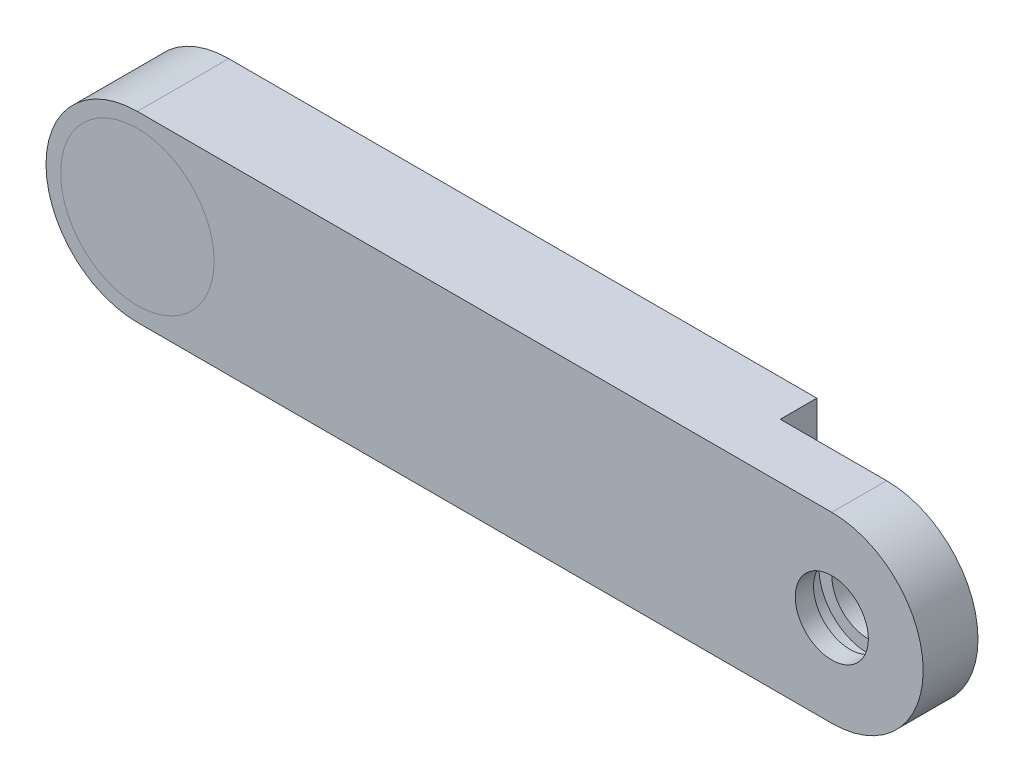
ISO-10303-21;
HEADER;
FILE_DESCRIPTION(('STEP AP214'),'2;1');
FILE_NAME('part.step','',(''),(''),'','','');
FILE_SCHEMA(('AUTOMOTIVE_DESIGN { 1 0 10303 214 1 1 1 1 }'));
ENDSEC;
DATA;
#1=APPLICATION_CONTEXT('core data for automotive mechanical design processes');
#2=APPLICATION_PROTOCOL_DEFINITION('international standard','automotive_design',2000,#1);
#3=PRODUCT_CONTEXT('',#1,'mechanical');
#4=PRODUCT('Part','Part','',(#3));
#5=PRODUCT_RELATED_PRODUCT_CATEGORY('part','',(#4));
#6=PRODUCT_DEFINITION_FORMATION('','',#4);
#7=PRODUCT_DEFINITION_CONTEXT('part definition',#1,'design');
#8=PRODUCT_DEFINITION('design','',#6,#7);
#9=PRODUCT_DEFINITION_SHAPE('','',#8);
#10=(LENGTH_UNIT() NAMED_UNIT(*) SI_UNIT(.MILLI.,.METRE.));
#11=(NAMED_UNIT(*) PLANE_ANGLE_UNIT() SI_UNIT($,.RADIAN.));
#12=(NAMED_UNIT(*) SI_UNIT($,.STERADIAN.) SOLID_ANGLE_UNIT());
#13=UNCERTAINTY_MEASURE_WITH_UNIT(LENGTH_MEASURE(1.E-05),#10,'distance_accuracy_value','');
#14=(GEOMETRIC_REPRESENTATION_CONTEXT(3) GLOBAL_UNCERTAINTY_ASSIGNED_CONTEXT((#13)) GLOBAL_UNIT_ASSIGNED_CONTEXT((#10,
#11,#12)) REPRESENTATION_CONTEXT('',''));
#15=CARTESIAN_POINT('',(0.,0.,0.));
#16=DIRECTION('',(0.,0.,1.));
#17=DIRECTION('',(1.,0.,0.));
#18=AXIS2_PLACEMENT_3D('',#15,#16,#17);
#19=CARTESIAN_POINT('',(-154.944852941176,0.,22.));
#20=DIRECTION('',(0.,0.,1.));
#21=DIRECTION('',(1.,0.,0.));
#22=AXIS2_PLACEMENT_3D('',#19,#20,#21);
#23=CYLINDRICAL_SURFACE('',#22,21.);
#24=CARTESIAN_POINT('',(-154.944852941176,0.,22.));
#25=DIRECTION('',(0.,0.,1.));
#26=DIRECTION('',(1.,0.,0.));
#27=AXIS2_PLACEMENT_3D('',#24,#25,#26);
#28=CIRCLE('',#27,21.);
#29=CARTESIAN_POINT('',(-133.944852941176,0.,22.));
#30=VERTEX_POINT('',#29);
#31=EDGE_CURVE('E11',#30,#30,#28,.T.);
#32=ORIENTED_EDGE('',*,*,#31,.T.);
#33=EDGE_LOOP('',(#32));
#34=FACE_BOUND('',#33,.T.);
#35=CARTESIAN_POINT('',(-154.944852941176,0.,25.));
#36=DIRECTION('',(0.,0.,1.));
#37=DIRECTION('',(1.,0.,0.));
#38=AXIS2_PLACEMENT_3D('',#35,#36,#37);
#39=CIRCLE('',#38,21.);
#40=CARTESIAN_POINT('',(-133.944852941176,0.,25.));
#41=VERTEX_POINT('',#40);
#42=EDGE_CURVE('E52',#41,#41,#39,.T.);
#43=ORIENTED_EDGE('',*,*,#42,.F.);
#44=EDGE_LOOP('',(#43));
#45=FACE_BOUND('',#44,.T.);
#46=ADVANCED_FACE('F49',(#34,#45),#23,.T.);
#47=CARTESIAN_POINT('',(-154.944852941176,0.,22.));
#48=DIRECTION('',(0.,0.,1.));
#49=DIRECTION('',(1.,0.,0.));
#50=AXIS2_PLACEMENT_3D('',#47,#48,#49);
#51=PLANE('',#50);
#52=ORIENTED_EDGE('',*,*,#31,.F.);
#53=EDGE_LOOP('',(#52));
#54=FACE_BOUND('',#53,.T.);
#55=ADVANCED_FACE('F64',(#54),#51,.F.);
#56=CARTESIAN_POINT('',(-154.944852941176,0.,25.));
#57=DIRECTION('',(0.,0.,1.));
#58=DIRECTION('',(1.,0.,0.));
#59=AXIS2_PLACEMENT_3D('',#56,#57,#58);
#60=PLANE('',#59);
#61=ORIENTED_EDGE('',*,*,#42,.T.);
#62=EDGE_LOOP('',(#61));
#63=FACE_BOUND('',#62,.T.);
#64=ADVANCED_FACE('F61',(#63),#60,.T.);
#65=CLOSED_SHELL('',(#46,#55,#64));
#66=MANIFOLD_SOLID_BREP('B2',#65);
#67=CARTESIAN_POINT('',(35.0551470588235,0.,25.));
#68=DIRECTION('',(0.,0.,-1.));
#69=DIRECTION('',(-1.,0.,0.));
#70=AXIS2_PLACEMENT_3D('',#67,#68,#69);
#71=CYLINDRICAL_SURFACE('',#70,25.);
#72=CARTESIAN_POINT('',(35.0551470588235,0.,10.));
#73=DIRECTION('',(0.,0.,-1.));
#74=DIRECTION('',(-1.,0.,0.));
#75=AXIS2_PLACEMENT_3D('',#72,#73,#74);
#76=CIRCLE('',#75,25.);
#77=CARTESIAN_POINT('',(35.0551470588235,25.,10.));
#78=VERTEX_POINT('',#77);
#79=CARTESIAN_POINT('',(35.0551470588235,-25.,10.));
#80=VERTEX_POINT('',#79);
#81=EDGE_CURVE('E155',#78,#80,#76,.T.);
#82=ORIENTED_EDGE('',*,*,#81,.F.);
#83=DIRECTION('',(0.,0.,-1.));
#84=VECTOR('',#83,1.);
#85=CARTESIAN_POINT('',(35.0551470588235,25.,25.));
#86=LINE('',#85,#84);
#87=CARTESIAN_POINT('',(35.0551470588235,25.,25.));
#88=VERTEX_POINT('',#87);
#89=EDGE_CURVE('E180',#88,#78,#86,.T.);
#90=ORIENTED_EDGE('',*,*,#89,.F.);
#91=CARTESIAN_POINT('',(35.0551470588235,0.,25.));
#92=DIRECTION('',(0.,0.,1.));
#93=DIRECTION('',(1.,0.,0.));
#94=AXIS2_PLACEMENT_3D('',#91,#92,#93);
#95=CIRCLE('',#94,25.);
#96=CARTESIAN_POINT('',(35.0551470588235,-25.,25.));
#97=VERTEX_POINT('',#96);
#98=EDGE_CURVE('E177',#97,#88,#95,.T.);
#99=ORIENTED_EDGE('',*,*,#98,.F.);
#100=DIRECTION('',(0.,0.,-1.));
#101=VECTOR('',#100,1.);
#102=CARTESIAN_POINT('',(35.0551470588235,-25.,25.));
#103=LINE('',#102,#101);
#104=EDGE_CURVE('E172',#97,#80,#103,.T.);
#105=ORIENTED_EDGE('',*,*,#104,.T.);
#106=EDGE_LOOP('',(#82,#90,#99,#105));
#107=FACE_BOUND('',#106,.T.);
#108=ADVANCED_FACE('F90',(#107),#71,.T.);
#109=CARTESIAN_POINT('',(35.0551470588235,0.,15.));
#110=DIRECTION('',(0.,0.,-1.));
#111=DIRECTION('',(-1.,0.,0.));
#112=AXIS2_PLACEMENT_3D('',#109,#110,#111);
#113=CYLINDRICAL_SURFACE('',#112,9.99999999999997);
#114=CARTESIAN_POINT('',(35.0551470588235,0.,15.));
#115=DIRECTION('',(0.,0.,-1.));
#116=DIRECTION('',(-1.,0.,0.));
#117=AXIS2_PLACEMENT_3D('',#114,#115,#116);
#118=CIRCLE('',#117,9.99999999999997);
#119=CARTESIAN_POINT('',(25.0551470588236,0.,15.));
#120=VERTEX_POINT('',#119);
#121=EDGE_CURVE('E272',#120,#120,#118,.T.);
#122=ORIENTED_EDGE('',*,*,#121,.F.);
#123=EDGE_LOOP('',(#122));
#124=FACE_BOUND('',#123,.T.);
#125=CARTESIAN_POINT('',(35.0551470588235,0.,10.));
#126=DIRECTION('',(0.,0.,-1.));
#127=DIRECTION('',(-1.,0.,0.));
#128=AXIS2_PLACEMENT_3D('',#125,#126,#127);
#129=CIRCLE('',#128,9.99999999999997);
#130=CARTESIAN_POINT('',(25.0551470588236,0.,10.));
#131=VERTEX_POINT('',#130);
#132=EDGE_CURVE('E94',#131,#131,#129,.F.);
#133=ORIENTED_EDGE('',*,*,#132,.F.);
#134=EDGE_LOOP('',(#133));
#135=FACE_BOUND('',#134,.T.);
#136=ADVANCED_FACE('F198',(#124,#135),#113,.F.);
#137=CARTESIAN_POINT('',(35.0551470588235,0.,0.));
#138=DIRECTION('',(0.,0.,1.));
#139=DIRECTION('',(1.,0.,0.));
#140=AXIS2_PLACEMENT_3D('',#137,#138,#139);
#141=CYLINDRICAL_SURFACE('',#140,13.4999999999999);
#142=CARTESIAN_POINT('',(35.0551470588235,0.,20.));
#143=DIRECTION('',(0.,0.,1.));
#144=DIRECTION('',(1.,0.,0.));
#145=AXIS2_PLACEMENT_3D('',#142,#143,#144);
#146=CIRCLE('',#145,13.4999999999999);
#147=CARTESIAN_POINT('',(48.5551470588235,0.,20.));
#148=VERTEX_POINT('',#147);
#149=EDGE_CURVE('E100',#148,#148,#146,.F.);
#150=ORIENTED_EDGE('',*,*,#149,.F.);
#151=EDGE_LOOP('',(#150));
#152=FACE_BOUND('',#151,.T.);
#153=CARTESIAN_POINT('',(35.0551470588235,0.,15.));
#154=DIRECTION('',(0.,0.,-1.));
#155=DIRECTION('',(-1.,0.,0.));
#156=AXIS2_PLACEMENT_3D('',#153,#154,#155);
#157=CIRCLE('',#156,13.4999999999999);
#158=CARTESIAN_POINT('',(21.5551470588236,0.,15.));
#159=VERTEX_POINT('',#158);
#160=EDGE_CURVE('E47',#159,#159,#157,.F.);
#161=ORIENTED_EDGE('',*,*,#160,.F.);
#162=EDGE_LOOP('',(#161));
#163=FACE_BOUND('',#162,.T.);
#164=ADVANCED_FACE('F195',(#152,#163),#141,.F.);
#165=CARTESIAN_POINT('',(-154.944852941176,0.,25.));
#166=DIRECTION('',(0.,0.,-1.));
#167=DIRECTION('',(-1.,0.,0.));
#168=AXIS2_PLACEMENT_3D('',#165,#166,#167);
#169=CYLINDRICAL_SURFACE('',#168,25.);
#170=CARTESIAN_POINT('',(-154.944852941176,0.,0.));
#171=DIRECTION('',(0.,0.,1.));
#172=DIRECTION('',(1.,0.,0.));
#173=AXIS2_PLACEMENT_3D('',#170,#171,#172);
#174=CIRCLE('',#173,25.);
#175=CARTESIAN_POINT('',(-154.944852941176,25.,0.));
#176=VERTEX_POINT('',#175);
#177=CARTESIAN_POINT('',(-154.944852941176,-25.,0.));
#178=VERTEX_POINT('',#177);
#179=EDGE_CURVE('E238',#176,#178,#174,.T.);
#180=ORIENTED_EDGE('',*,*,#179,.T.);
#181=DIRECTION('',(0.,0.,-1.));
#182=VECTOR('',#181,1.);
#183=CARTESIAN_POINT('',(-154.944852941176,-25.,25.));
#184=LINE('',#183,#182);
#185=CARTESIAN_POINT('',(-154.944852941176,-25.,25.));
#186=VERTEX_POINT('',#185);
#187=EDGE_CURVE('E179',#186,#178,#184,.T.);
#188=ORIENTED_EDGE('',*,*,#187,.F.);
#189=CARTESIAN_POINT('',(-154.944852941176,0.,25.));
#190=DIRECTION('',(0.,0.,1.));
#191=DIRECTION('',(1.,0.,0.));
#192=AXIS2_PLACEMENT_3D('',#189,#190,#191);
#193=CIRCLE('',#192,25.);
#194=CARTESIAN_POINT('',(-154.944852941176,25.,25.));
#195=VERTEX_POINT('',#194);
#196=EDGE_CURVE('E255',#195,#186,#193,.T.);
#197=ORIENTED_EDGE('',*,*,#196,.F.);
#198=DIRECTION('',(0.,0.,-1.));
#199=VECTOR('',#198,1.);
#200=CARTESIAN_POINT('',(-154.944852941176,25.,25.));
#201=LINE('',#200,#199);
#202=EDGE_CURVE('E185',#195,#176,#201,.T.);
#203=ORIENTED_EDGE('',*,*,#202,.T.);
#204=EDGE_LOOP('',(#180,#188,#197,#203));
#205=FACE_BOUND('',#204,.T.);
#206=ADVANCED_FACE('F92',(#205),#169,.T.);
#207=CARTESIAN_POINT('',(-154.944852941176,-25.,25.));
#208=DIRECTION('',(0.,1.,0.));
#209=DIRECTION('',(0.,0.,1.));
#210=AXIS2_PLACEMENT_3D('',#207,#208,#209);
#211=PLANE('',#210);
#212=DIRECTION('',(1.,0.,0.));
#213=VECTOR('',#212,1.);
#214=CARTESIAN_POINT('',(-154.944852941176,-25.,0.));
#215=LINE('',#214,#213);
#216=CARTESIAN_POINT('',(5.95716170053603,-25.,0.));
#217=VERTEX_POINT('',#216);
#218=EDGE_CURVE('E242',#178,#217,#215,.T.);
#219=ORIENTED_EDGE('',*,*,#218,.T.);
#220=DIRECTION('',(0.,0.,-1.));
#221=VECTOR('',#220,1.);
#222=CARTESIAN_POINT('',(5.95716170053603,-25.,10.));
#223=LINE('',#222,#221);
#224=CARTESIAN_POINT('',(5.95716170053603,-25.,10.));
#225=VERTEX_POINT('',#224);
#226=EDGE_CURVE('E107',#225,#217,#223,.T.);
#227=ORIENTED_EDGE('',*,*,#226,.F.);
#228=DIRECTION('',(-1.,0.,0.));
#229=VECTOR('',#228,1.);
#230=CARTESIAN_POINT('',(35.0551470588235,-25.,10.));
#231=LINE('',#230,#229);
#232=EDGE_CURVE('E160',#80,#225,#231,.T.);
#233=ORIENTED_EDGE('',*,*,#232,.F.);
#234=ORIENTED_EDGE('',*,*,#104,.F.);
#235=DIRECTION('',(1.,0.,0.));
#236=VECTOR('',#235,1.);
#237=CARTESIAN_POINT('',(-154.944852941176,-25.,25.));
#238=LINE('',#237,#236);
#239=EDGE_CURVE('E139',#186,#97,#238,.T.);
#240=ORIENTED_EDGE('',*,*,#239,.F.);
#241=ORIENTED_EDGE('',*,*,#187,.T.);
#242=EDGE_LOOP('',(#219,#227,#233,#234,#240,#241));
#243=FACE_BOUND('',#242,.T.);
#244=ADVANCED_FACE('F171',(#243),#211,.F.);
#245=CARTESIAN_POINT('',(-154.944852941176,25.,25.));
#246=DIRECTION('',(0.,-1.,0.));
#247=DIRECTION('',(0.,0.,-1.));
#248=AXIS2_PLACEMENT_3D('',#245,#246,#247);
#249=PLANE('',#248);
#250=DIRECTION('',(1.,0.,0.));
#251=VECTOR('',#250,1.);
#252=CARTESIAN_POINT('',(35.0551470588235,25.,10.));
#253=LINE('',#252,#251);
#254=CARTESIAN_POINT('',(5.95716170053603,25.,10.));
#255=VERTEX_POINT('',#254);
#256=EDGE_CURVE('E162',#255,#78,#253,.T.);
#257=ORIENTED_EDGE('',*,*,#256,.F.);
#258=DIRECTION('',(0.,0.,-1.));
#259=VECTOR('',#258,1.);
#260=CARTESIAN_POINT('',(5.95716170053603,25.,10.));
#261=LINE('',#260,#259);
#262=CARTESIAN_POINT('',(5.95716170053603,25.,0.));
#263=VERTEX_POINT('',#262);
#264=EDGE_CURVE('E280',#255,#263,#261,.T.);
#265=ORIENTED_EDGE('',*,*,#264,.T.);
#266=DIRECTION('',(-1.,0.,0.));
#267=VECTOR('',#266,1.);
#268=CARTESIAN_POINT('',(-154.944852941176,25.,0.));
#269=LINE('',#268,#267);
#270=EDGE_CURVE('E131',#263,#176,#269,.T.);
#271=ORIENTED_EDGE('',*,*,#270,.T.);
#272=ORIENTED_EDGE('',*,*,#202,.F.);
#273=DIRECTION('',(-1.,0.,0.));
#274=VECTOR('',#273,1.);
#275=CARTESIAN_POINT('',(-154.944852941176,25.,25.));
#276=LINE('',#275,#274);
#277=EDGE_CURVE('E116',#88,#195,#276,.T.);
#278=ORIENTED_EDGE('',*,*,#277,.F.);
#279=ORIENTED_EDGE('',*,*,#89,.T.);
#280=EDGE_LOOP('',(#257,#265,#271,#272,#278,#279));
#281=FACE_BOUND('',#280,.T.);
#282=ADVANCED_FACE('F224',(#281),#249,.F.);
#283=CARTESIAN_POINT('',(-154.944852941176,0.,25.));
#284=DIRECTION('',(0.,0.,1.));
#285=DIRECTION('',(1.,0.,0.));
#286=AXIS2_PLACEMENT_3D('',#283,#284,#285);
#287=PLANE('',#286);
#288=CARTESIAN_POINT('',(-154.944852941176,0.,25.));
#289=DIRECTION('',(0.,0.,1.));
#290=DIRECTION('',(1.,0.,0.));
#291=AXIS2_PLACEMENT_3D('',#288,#289,#290);
#292=CIRCLE('',#291,21.);
#293=CARTESIAN_POINT('',(-133.944852941176,0.,25.));
#294=VERTEX_POINT('',#293);
#295=EDGE_CURVE('E249',#294,#294,#292,.T.);
#296=ORIENTED_EDGE('',*,*,#295,.F.);
#297=EDGE_LOOP('',(#296));
#298=FACE_BOUND('',#297,.T.);
#299=ORIENTED_EDGE('',*,*,#196,.T.);
#300=ORIENTED_EDGE('',*,*,#239,.T.);
#301=ORIENTED_EDGE('',*,*,#98,.T.);
#302=ORIENTED_EDGE('',*,*,#277,.T.);
#303=EDGE_LOOP('',(#299,#300,#301,#302));
#304=FACE_BOUND('',#303,.T.);
#305=CARTESIAN_POINT('',(35.0551470588235,0.,25.));
#306=DIRECTION('',(0.,0.,1.));
#307=DIRECTION('',(1.,0.,0.));
#308=AXIS2_PLACEMENT_3D('',#305,#306,#307);
#309=CIRCLE('',#308,9.99999999999998);
#310=CARTESIAN_POINT('',(45.0551470588235,0.,25.));
#311=VERTEX_POINT('',#310);
#312=EDGE_CURVE('E268',#311,#311,#309,.T.);
#313=ORIENTED_EDGE('',*,*,#312,.F.);
#314=EDGE_LOOP('',(#313));
#315=FACE_BOUND('',#314,.T.);
#316=ADVANCED_FACE('F231',(#298,#304,#315),#287,.T.);
#317=CARTESIAN_POINT('',(-154.944852941176,0.,0.));
#318=DIRECTION('',(0.,0.,1.));
#319=DIRECTION('',(1.,0.,0.));
#320=AXIS2_PLACEMENT_3D('',#317,#318,#319);
#321=PLANE('',#320);
#322=CARTESIAN_POINT('',(-154.944852941176,0.,0.));
#323=DIRECTION('',(0.,0.,1.));
#324=DIRECTION('',(1.,0.,0.));
#325=AXIS2_PLACEMENT_3D('',#322,#323,#324);
#326=CIRCLE('',#325,21.);
#327=CARTESIAN_POINT('',(-133.944852941176,0.,0.));
#328=VERTEX_POINT('',#327);
#329=EDGE_CURVE('E243',#328,#328,#326,.T.);
#330=ORIENTED_EDGE('',*,*,#329,.T.);
#331=EDGE_LOOP('',(#330));
#332=FACE_BOUND('',#331,.T.);
#333=ORIENTED_EDGE('',*,*,#270,.F.);
#334=DIRECTION('',(0.,1.,0.));
#335=VECTOR('',#334,1.);
#336=CARTESIAN_POINT('',(5.95716170053603,-25.,0.));
#337=LINE('',#336,#335);
#338=EDGE_CURVE('E168',#217,#263,#337,.T.);
#339=ORIENTED_EDGE('',*,*,#338,.F.);
#340=ORIENTED_EDGE('',*,*,#218,.F.);
#341=ORIENTED_EDGE('',*,*,#179,.F.);
#342=EDGE_LOOP('',(#333,#339,#340,#341));
#343=FACE_BOUND('',#342,.T.);
#344=ADVANCED_FACE('F290',(#332,#343),#321,.F.);
#345=CARTESIAN_POINT('',(-154.944852941176,0.,0.));
#346=DIRECTION('',(0.,0.,1.));
#347=DIRECTION('',(1.,0.,0.));
#348=AXIS2_PLACEMENT_3D('',#345,#346,#347);
#349=CYLINDRICAL_SURFACE('',#348,21.);
#350=ORIENTED_EDGE('',*,*,#329,.F.);
#351=EDGE_LOOP('',(#350));
#352=FACE_BOUND('',#351,.T.);
#353=ORIENTED_EDGE('',*,*,#295,.T.);
#354=EDGE_LOOP('',(#353));
#355=FACE_BOUND('',#354,.T.);
#356=ADVANCED_FACE('F298',(#352,#355),#349,.F.);
#357=CARTESIAN_POINT('',(35.0551470588235,0.,20.));
#358=DIRECTION('',(0.,0.,1.));
#359=DIRECTION('',(1.,0.,0.));
#360=AXIS2_PLACEMENT_3D('',#357,#358,#359);
#361=PLANE('',#360);
#362=CARTESIAN_POINT('',(35.0551470588235,0.,20.));
#363=DIRECTION('',(0.,0.,1.));
#364=DIRECTION('',(1.,0.,0.));
#365=AXIS2_PLACEMENT_3D('',#362,#363,#364);
#366=CIRCLE('',#365,9.99999999999998);
#367=CARTESIAN_POINT('',(45.0551470588235,0.,20.));
#368=VERTEX_POINT('',#367);
#369=EDGE_CURVE('E266',#368,#368,#366,.T.);
#370=ORIENTED_EDGE('',*,*,#369,.T.);
#371=EDGE_LOOP('',(#370));
#372=FACE_BOUND('',#371,.T.);
#373=ORIENTED_EDGE('',*,*,#149,.T.);
#374=EDGE_LOOP('',(#373));
#375=FACE_BOUND('',#374,.T.);
#376=ADVANCED_FACE('F193',(#372,#375),#361,.F.);
#377=CARTESIAN_POINT('',(35.0551470588235,0.,20.));
#378=DIRECTION('',(0.,0.,1.));
#379=DIRECTION('',(1.,0.,0.));
#380=AXIS2_PLACEMENT_3D('',#377,#378,#379);
#381=CYLINDRICAL_SURFACE('',#380,9.99999999999998);
#382=ORIENTED_EDGE('',*,*,#369,.F.);
#383=EDGE_LOOP('',(#382));
#384=FACE_BOUND('',#383,.T.);
#385=ORIENTED_EDGE('',*,*,#312,.T.);
#386=EDGE_LOOP('',(#385));
#387=FACE_BOUND('',#386,.T.);
#388=ADVANCED_FACE('F204',(#384,#387),#381,.F.);
#389=CARTESIAN_POINT('',(35.0551470588235,0.,15.));
#390=DIRECTION('',(0.,0.,-1.));
#391=DIRECTION('',(-1.,0.,0.));
#392=AXIS2_PLACEMENT_3D('',#389,#390,#391);
#393=PLANE('',#392);
#394=ORIENTED_EDGE('',*,*,#121,.T.);
#395=EDGE_LOOP('',(#394));
#396=FACE_BOUND('',#395,.T.);
#397=ORIENTED_EDGE('',*,*,#160,.T.);
#398=EDGE_LOOP('',(#397));
#399=FACE_BOUND('',#398,.T.);
#400=ADVANCED_FACE('F202',(#396,#399),#393,.F.);
#401=CARTESIAN_POINT('',(35.0551470588235,0.,10.));
#402=DIRECTION('',(0.,0.,-1.));
#403=DIRECTION('',(-1.,0.,0.));
#404=AXIS2_PLACEMENT_3D('',#401,#402,#403);
#405=PLANE('',#404);
#406=ORIENTED_EDGE('',*,*,#81,.T.);
#407=ORIENTED_EDGE('',*,*,#232,.T.);
#408=DIRECTION('',(0.,1.,0.));
#409=VECTOR('',#408,1.);
#410=CARTESIAN_POINT('',(5.95716170053603,-25.,10.));
#411=LINE('',#410,#409);
#412=EDGE_CURVE('E175',#225,#255,#411,.T.);
#413=ORIENTED_EDGE('',*,*,#412,.T.);
#414=ORIENTED_EDGE('',*,*,#256,.T.);
#415=EDGE_LOOP('',(#406,#407,#413,#414));
#416=FACE_BOUND('',#415,.T.);
#417=ORIENTED_EDGE('',*,*,#132,.T.);
#418=EDGE_LOOP('',(#417));
#419=FACE_BOUND('',#418,.T.);
#420=ADVANCED_FACE('F157',(#416,#419),#405,.T.);
#421=CARTESIAN_POINT('',(5.95716170053603,-25.,10.));
#422=DIRECTION('',(-1.,0.,0.));
#423=DIRECTION('',(0.,0.,1.));
#424=AXIS2_PLACEMENT_3D('',#421,#422,#423);
#425=PLANE('',#424);
#426=ORIENTED_EDGE('',*,*,#338,.T.);
#427=ORIENTED_EDGE('',*,*,#264,.F.);
#428=ORIENTED_EDGE('',*,*,#412,.F.);
#429=ORIENTED_EDGE('',*,*,#226,.T.);
#430=EDGE_LOOP('',(#426,#427,#428,#429));
#431=FACE_BOUND('',#430,.T.);
#432=ADVANCED_FACE('F211',(#431),#425,.F.);
#433=CLOSED_SHELL('',(#108,#136,#164,#206,#244,#282,#316,#344,#356,#376,#388,#400,#420,#432));
#434=MANIFOLD_SOLID_BREP('B6',#433);
#435=ADVANCED_BREP_SHAPE_REPRESENTATION('',(#18,#66,#434),#14);
#436=SHAPE_DEFINITION_REPRESENTATION(#9,#435);
ENDSEC;
END-ISO-10303-21;
